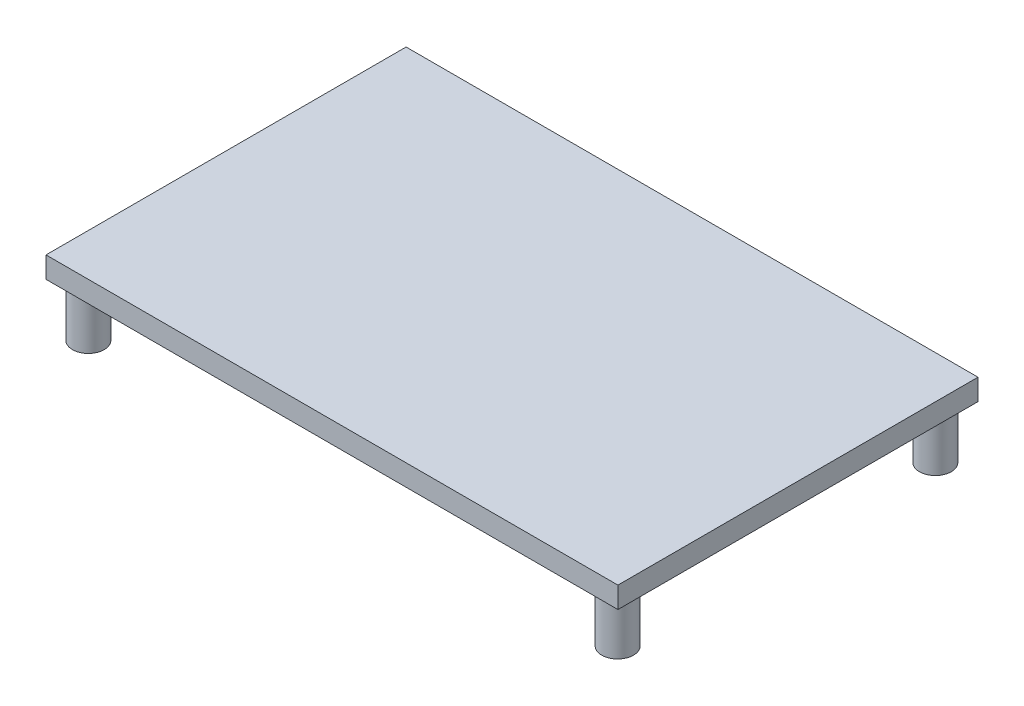
ISO-10303-21;
HEADER;
FILE_DESCRIPTION(('STEP AP214'),'2;1');
FILE_NAME('part.step','',(''),(''),'','','');
FILE_SCHEMA(('AUTOMOTIVE_DESIGN { 1 0 10303 214 1 1 1 1 }'));
ENDSEC;
DATA;
#1=APPLICATION_CONTEXT('core data for automotive mechanical design processes');
#2=APPLICATION_PROTOCOL_DEFINITION('international standard','automotive_design',2000,#1);
#3=PRODUCT_CONTEXT('',#1,'mechanical');
#4=PRODUCT('Part','Part','',(#3));
#5=PRODUCT_RELATED_PRODUCT_CATEGORY('part','',(#4));
#6=PRODUCT_DEFINITION_FORMATION('','',#4);
#7=PRODUCT_DEFINITION_CONTEXT('part definition',#1,'design');
#8=PRODUCT_DEFINITION('design','',#6,#7);
#9=PRODUCT_DEFINITION_SHAPE('','',#8);
#10=(LENGTH_UNIT() NAMED_UNIT(*) SI_UNIT(.MILLI.,.METRE.));
#11=(NAMED_UNIT(*) PLANE_ANGLE_UNIT() SI_UNIT($,.RADIAN.));
#12=(NAMED_UNIT(*) SI_UNIT($,.STERADIAN.) SOLID_ANGLE_UNIT());
#13=UNCERTAINTY_MEASURE_WITH_UNIT(LENGTH_MEASURE(1.E-05),#10,'distance_accuracy_value','');
#14=(GEOMETRIC_REPRESENTATION_CONTEXT(3) GLOBAL_UNCERTAINTY_ASSIGNED_CONTEXT((#13)) GLOBAL_UNIT_ASSIGNED_CONTEXT((#10,
#11,#12)) REPRESENTATION_CONTEXT('',''));
#15=CARTESIAN_POINT('',(0.,0.,0.));
#16=DIRECTION('',(0.,0.,1.));
#17=DIRECTION('',(1.,0.,0.));
#18=AXIS2_PLACEMENT_3D('',#15,#16,#17);
#19=CARTESIAN_POINT('',(-42.0738607660712,2.,-39.0055651757915));
#20=DIRECTION('',(1.,0.,0.));
#21=DIRECTION('',(0.,0.,-1.));
#22=AXIS2_PLACEMENT_3D('',#19,#20,#21);
#23=PLANE('',#22);
#24=DIRECTION('',(0.,0.,1.));
#25=VECTOR('',#24,1.);
#26=CARTESIAN_POINT('',(-42.0738607660712,0.,-39.0055651757915));
#27=LINE('',#26,#25);
#28=CARTESIAN_POINT('',(-42.0738607660712,0.,-39.0055651757915));
#29=VERTEX_POINT('',#28);
#30=CARTESIAN_POINT('',(-42.0738607660712,0.,-5.00556517579136));
#31=VERTEX_POINT('',#30);
#32=EDGE_CURVE('E161',#29,#31,#27,.T.);
#33=ORIENTED_EDGE('',*,*,#32,.T.);
#34=DIRECTION('',(0.,-1.,0.));
#35=VECTOR('',#34,1.);
#36=CARTESIAN_POINT('',(-42.0738607660712,2.,-5.00556517579136));
#37=LINE('',#36,#35);
#38=CARTESIAN_POINT('',(-42.0738607660712,2.,-5.00556517579136));
#39=VERTEX_POINT('',#38);
#40=EDGE_CURVE('E184',#39,#31,#37,.T.);
#41=ORIENTED_EDGE('',*,*,#40,.F.);
#42=DIRECTION('',(0.,0.,1.));
#43=VECTOR('',#42,1.);
#44=CARTESIAN_POINT('',(-42.0738607660712,2.,-39.0055651757915));
#45=LINE('',#44,#43);
#46=CARTESIAN_POINT('',(-42.0738607660712,2.,-39.0055651757915));
#47=VERTEX_POINT('',#46);
#48=EDGE_CURVE('E162',#47,#39,#45,.T.);
#49=ORIENTED_EDGE('',*,*,#48,.F.);
#50=DIRECTION('',(0.,-1.,0.));
#51=VECTOR('',#50,1.);
#52=CARTESIAN_POINT('',(-42.0738607660712,2.,-39.0055651757915));
#53=LINE('',#52,#51);
#54=EDGE_CURVE('E64',#47,#29,#53,.T.);
#55=ORIENTED_EDGE('',*,*,#54,.T.);
#56=EDGE_LOOP('',(#33,#41,#49,#55));
#57=FACE_BOUND('',#56,.T.);
#58=ADVANCED_FACE('F48',(#57),#23,.F.);
#59=CARTESIAN_POINT('',(-42.0738607660712,2.,-5.00556517579136));
#60=DIRECTION('',(0.,0.,-1.));
#61=DIRECTION('',(-1.,0.,0.));
#62=AXIS2_PLACEMENT_3D('',#59,#60,#61);
#63=PLANE('',#62);
#64=DIRECTION('',(1.,0.,0.));
#65=VECTOR('',#64,1.);
#66=CARTESIAN_POINT('',(-42.0738607660712,0.,-5.00556517579136));
#67=LINE('',#66,#65);
#68=CARTESIAN_POINT('',(11.9261392339288,0.,-5.00556517579136));
#69=VERTEX_POINT('',#68);
#70=EDGE_CURVE('E172',#31,#69,#67,.T.);
#71=ORIENTED_EDGE('',*,*,#70,.T.);
#72=DIRECTION('',(0.,-1.,0.));
#73=VECTOR('',#72,1.);
#74=CARTESIAN_POINT('',(11.9261392339288,2.,-5.00556517579136));
#75=LINE('',#74,#73);
#76=CARTESIAN_POINT('',(11.9261392339288,2.,-5.00556517579136));
#77=VERTEX_POINT('',#76);
#78=EDGE_CURVE('E182',#77,#69,#75,.T.);
#79=ORIENTED_EDGE('',*,*,#78,.F.);
#80=DIRECTION('',(1.,0.,0.));
#81=VECTOR('',#80,1.);
#82=CARTESIAN_POINT('',(-42.0738607660712,2.,-5.00556517579136));
#83=LINE('',#82,#81);
#84=EDGE_CURVE('E91',#39,#77,#83,.T.);
#85=ORIENTED_EDGE('',*,*,#84,.F.);
#86=ORIENTED_EDGE('',*,*,#40,.T.);
#87=EDGE_LOOP('',(#71,#79,#85,#86));
#88=FACE_BOUND('',#87,.T.);
#89=ADVANCED_FACE('F218',(#88),#63,.F.);
#90=CARTESIAN_POINT('',(11.9261392339288,2.,-39.0055651757915));
#91=DIRECTION('',(1.,0.,0.));
#92=DIRECTION('',(0.,0.,-1.));
#93=AXIS2_PLACEMENT_3D('',#90,#91,#92);
#94=PLANE('',#93);
#95=DIRECTION('',(0.,0.,1.));
#96=VECTOR('',#95,1.);
#97=CARTESIAN_POINT('',(11.9261392339288,0.,-39.0055651757915));
#98=LINE('',#97,#96);
#99=CARTESIAN_POINT('',(11.9261392339288,0.,-39.0055651757915));
#100=VERTEX_POINT('',#99);
#101=EDGE_CURVE('E175',#100,#69,#98,.T.);
#102=ORIENTED_EDGE('',*,*,#101,.F.);
#103=DIRECTION('',(0.,-1.,0.));
#104=VECTOR('',#103,1.);
#105=CARTESIAN_POINT('',(11.9261392339288,2.,-39.0055651757915));
#106=LINE('',#105,#104);
#107=CARTESIAN_POINT('',(11.9261392339288,2.,-39.0055651757915));
#108=VERTEX_POINT('',#107);
#109=EDGE_CURVE('E79',#108,#100,#106,.T.);
#110=ORIENTED_EDGE('',*,*,#109,.F.);
#111=DIRECTION('',(0.,0.,1.));
#112=VECTOR('',#111,1.);
#113=CARTESIAN_POINT('',(11.9261392339288,2.,-39.0055651757915));
#114=LINE('',#113,#112);
#115=EDGE_CURVE('E166',#108,#77,#114,.T.);
#116=ORIENTED_EDGE('',*,*,#115,.T.);
#117=ORIENTED_EDGE('',*,*,#78,.T.);
#118=EDGE_LOOP('',(#102,#110,#116,#117));
#119=FACE_BOUND('',#118,.T.);
#120=ADVANCED_FACE('F210',(#119),#94,.T.);
#121=CARTESIAN_POINT('',(-42.0738607660712,2.,-39.0055651757915));
#122=DIRECTION('',(0.,0.,-1.));
#123=DIRECTION('',(-1.,0.,0.));
#124=AXIS2_PLACEMENT_3D('',#121,#122,#123);
#125=PLANE('',#124);
#126=DIRECTION('',(1.,0.,0.));
#127=VECTOR('',#126,1.);
#128=CARTESIAN_POINT('',(-42.0738607660712,0.,-39.0055651757915));
#129=LINE('',#128,#127);
#130=EDGE_CURVE('E164',#29,#100,#129,.T.);
#131=ORIENTED_EDGE('',*,*,#130,.F.);
#132=ORIENTED_EDGE('',*,*,#54,.F.);
#133=DIRECTION('',(1.,0.,0.));
#134=VECTOR('',#133,1.);
#135=CARTESIAN_POINT('',(-42.0738607660712,2.,-39.0055651757915));
#136=LINE('',#135,#134);
#137=EDGE_CURVE('E169',#47,#108,#136,.T.);
#138=ORIENTED_EDGE('',*,*,#137,.T.);
#139=ORIENTED_EDGE('',*,*,#109,.T.);
#140=EDGE_LOOP('',(#131,#132,#138,#139));
#141=FACE_BOUND('',#140,.T.);
#142=ADVANCED_FACE('F208',(#141),#125,.T.);
#143=CARTESIAN_POINT('',(0.,2.,0.));
#144=DIRECTION('',(0.,1.,0.));
#145=DIRECTION('',(0.,0.,1.));
#146=AXIS2_PLACEMENT_3D('',#143,#144,#145);
#147=PLANE('',#146);
#148=ORIENTED_EDGE('',*,*,#48,.T.);
#149=ORIENTED_EDGE('',*,*,#84,.T.);
#150=ORIENTED_EDGE('',*,*,#115,.F.);
#151=ORIENTED_EDGE('',*,*,#137,.F.);
#152=EDGE_LOOP('',(#148,#149,#150,#151));
#153=FACE_BOUND('',#152,.T.);
#154=ADVANCED_FACE('F200',(#153),#147,.T.);
#155=CARTESIAN_POINT('',(0.,0.,0.));
#156=DIRECTION('',(0.,1.,0.));
#157=DIRECTION('',(0.,0.,1.));
#158=AXIS2_PLACEMENT_3D('',#155,#156,#157);
#159=PLANE('',#158);
#160=CARTESIAN_POINT('',(-40.0738607660712,0.,-37.0055651757914));
#161=DIRECTION('',(0.,1.,0.));
#162=DIRECTION('',(0.,0.,1.));
#163=AXIS2_PLACEMENT_3D('',#160,#161,#162);
#164=CIRCLE('',#163,1.5);
#165=CARTESIAN_POINT('',(-40.0738607660712,0.,-35.5055651757914));
#166=VERTEX_POINT('',#165);
#167=EDGE_CURVE('E11',#166,#166,#164,.F.);
#168=ORIENTED_EDGE('',*,*,#167,.F.);
#169=EDGE_LOOP('',(#168));
#170=FACE_BOUND('',#169,.T.);
#171=CARTESIAN_POINT('',(-40.0738607660712,0.,-7.00556517579136));
#172=DIRECTION('',(0.,1.,0.));
#173=DIRECTION('',(0.,0.,1.));
#174=AXIS2_PLACEMENT_3D('',#171,#172,#173);
#175=CIRCLE('',#174,1.5);
#176=CARTESIAN_POINT('',(-40.0738607660712,0.,-5.50556517579136));
#177=VERTEX_POINT('',#176);
#178=EDGE_CURVE('E56',#177,#177,#175,.F.);
#179=ORIENTED_EDGE('',*,*,#178,.F.);
#180=EDGE_LOOP('',(#179));
#181=FACE_BOUND('',#180,.T.);
#182=CARTESIAN_POINT('',(9.89786334253558,0.,-7.00670077458383));
#183=DIRECTION('',(0.,1.,0.));
#184=DIRECTION('',(0.,0.,1.));
#185=AXIS2_PLACEMENT_3D('',#182,#183,#184);
#186=CIRCLE('',#185,1.5);
#187=CARTESIAN_POINT('',(9.89786334253558,0.,-5.50670077458383));
#188=VERTEX_POINT('',#187);
#189=EDGE_CURVE('E189',#188,#188,#186,.F.);
#190=ORIENTED_EDGE('',*,*,#189,.F.);
#191=EDGE_LOOP('',(#190));
#192=FACE_BOUND('',#191,.T.);
#193=CARTESIAN_POINT('',(9.89786334253558,0.,-37.0067007745839));
#194=DIRECTION('',(0.,1.,0.));
#195=DIRECTION('',(0.,0.,1.));
#196=AXIS2_PLACEMENT_3D('',#193,#194,#195);
#197=CIRCLE('',#196,1.5);
#198=CARTESIAN_POINT('',(9.89786334253558,0.,-35.5067007745839));
#199=VERTEX_POINT('',#198);
#200=EDGE_CURVE('E186',#199,#199,#197,.F.);
#201=ORIENTED_EDGE('',*,*,#200,.F.);
#202=EDGE_LOOP('',(#201));
#203=FACE_BOUND('',#202,.T.);
#204=ORIENTED_EDGE('',*,*,#32,.F.);
#205=ORIENTED_EDGE('',*,*,#130,.T.);
#206=ORIENTED_EDGE('',*,*,#101,.T.);
#207=ORIENTED_EDGE('',*,*,#70,.F.);
#208=EDGE_LOOP('',(#204,#205,#206,#207));
#209=FACE_BOUND('',#208,.T.);
#210=ADVANCED_FACE('F196',(#170,#181,#192,#203,#209),#159,.F.);
#211=CARTESIAN_POINT('',(9.89786334253558,-5.,-37.0067007745839));
#212=DIRECTION('',(0.,1.,0.));
#213=DIRECTION('',(0.,0.,1.));
#214=AXIS2_PLACEMENT_3D('',#211,#212,#213);
#215=CYLINDRICAL_SURFACE('',#214,1.5);
#216=CARTESIAN_POINT('',(9.89786334253558,-5.,-37.0067007745839));
#217=DIRECTION('',(0.,-1.,0.));
#218=DIRECTION('',(0.,0.,-1.));
#219=AXIS2_PLACEMENT_3D('',#216,#217,#218);
#220=CIRCLE('',#219,1.5);
#221=CARTESIAN_POINT('',(9.89786334253558,-5.,-38.5067007745839));
#222=VERTEX_POINT('',#221);
#223=EDGE_CURVE('E153',#222,#222,#220,.T.);
#224=ORIENTED_EDGE('',*,*,#223,.F.);
#225=EDGE_LOOP('',(#224));
#226=FACE_BOUND('',#225,.T.);
#227=ORIENTED_EDGE('',*,*,#200,.T.);
#228=EDGE_LOOP('',(#227));
#229=FACE_BOUND('',#228,.T.);
#230=ADVANCED_FACE('F199',(#226,#229),#215,.T.);
#231=CARTESIAN_POINT('',(9.89786334253558,-5.,-37.0067007745839));
#232=DIRECTION('',(0.,-1.,0.));
#233=DIRECTION('',(0.,0.,-1.));
#234=AXIS2_PLACEMENT_3D('',#231,#232,#233);
#235=PLANE('',#234);
#236=CARTESIAN_POINT('',(9.89786334253558,-5.,-37.0067007745839));
#237=DIRECTION('',(0.,-1.,0.));
#238=DIRECTION('',(0.,0.,-1.));
#239=AXIS2_PLACEMENT_3D('',#236,#237,#238);
#240=CIRCLE('',#239,0.625000000000001);
#241=CARTESIAN_POINT('',(9.89786334253558,-5.,-37.6317007745839));
#242=VERTEX_POINT('',#241);
#243=EDGE_CURVE('E140',#242,#242,#240,.T.);
#244=ORIENTED_EDGE('',*,*,#243,.F.);
#245=EDGE_LOOP('',(#244));
#246=FACE_BOUND('',#245,.T.);
#247=ORIENTED_EDGE('',*,*,#223,.T.);
#248=EDGE_LOOP('',(#247));
#249=FACE_BOUND('',#248,.T.);
#250=ADVANCED_FACE('F260',(#246,#249),#235,.T.);
#251=CARTESIAN_POINT('',(9.89786334253558,-5.,-7.00670077458383));
#252=DIRECTION('',(0.,1.,0.));
#253=DIRECTION('',(0.,0.,1.));
#254=AXIS2_PLACEMENT_3D('',#251,#252,#253);
#255=CYLINDRICAL_SURFACE('',#254,1.5);
#256=CARTESIAN_POINT('',(9.89786334253558,-5.,-7.00670077458383));
#257=DIRECTION('',(0.,-1.,0.));
#258=DIRECTION('',(0.,0.,-1.));
#259=AXIS2_PLACEMENT_3D('',#256,#257,#258);
#260=CIRCLE('',#259,1.5);
#261=CARTESIAN_POINT('',(9.89786334253558,-5.,-8.50670077458383));
#262=VERTEX_POINT('',#261);
#263=EDGE_CURVE('E150',#262,#262,#260,.T.);
#264=ORIENTED_EDGE('',*,*,#263,.F.);
#265=EDGE_LOOP('',(#264));
#266=FACE_BOUND('',#265,.T.);
#267=ORIENTED_EDGE('',*,*,#189,.T.);
#268=EDGE_LOOP('',(#267));
#269=FACE_BOUND('',#268,.T.);
#270=ADVANCED_FACE('F272',(#266,#269),#255,.T.);
#271=CARTESIAN_POINT('',(9.89786334253558,-5.,-7.00670077458383));
#272=DIRECTION('',(0.,-1.,0.));
#273=DIRECTION('',(0.,0.,-1.));
#274=AXIS2_PLACEMENT_3D('',#271,#272,#273);
#275=PLANE('',#274);
#276=CARTESIAN_POINT('',(9.89786334253558,-5.,-7.00670077458383));
#277=DIRECTION('',(0.,-1.,0.));
#278=DIRECTION('',(0.,0.,-1.));
#279=AXIS2_PLACEMENT_3D('',#276,#277,#278);
#280=CIRCLE('',#279,0.625000000000001);
#281=CARTESIAN_POINT('',(9.89786334253558,-5.,-7.63170077458383));
#282=VERTEX_POINT('',#281);
#283=EDGE_CURVE('E131',#282,#282,#280,.T.);
#284=ORIENTED_EDGE('',*,*,#283,.F.);
#285=EDGE_LOOP('',(#284));
#286=FACE_BOUND('',#285,.T.);
#287=ORIENTED_EDGE('',*,*,#263,.T.);
#288=EDGE_LOOP('',(#287));
#289=FACE_BOUND('',#288,.T.);
#290=ADVANCED_FACE('F283',(#286,#289),#275,.T.);
#291=CARTESIAN_POINT('',(-40.0738607660712,-5.,-7.00556517579136));
#292=DIRECTION('',(0.,1.,0.));
#293=DIRECTION('',(0.,0.,1.));
#294=AXIS2_PLACEMENT_3D('',#291,#292,#293);
#295=CYLINDRICAL_SURFACE('',#294,1.5);
#296=CARTESIAN_POINT('',(-40.0738607660712,-5.,-7.00556517579136));
#297=DIRECTION('',(0.,-1.,0.));
#298=DIRECTION('',(0.,0.,-1.));
#299=AXIS2_PLACEMENT_3D('',#296,#297,#298);
#300=CIRCLE('',#299,1.5);
#301=CARTESIAN_POINT('',(-40.0738607660712,-5.,-8.50556517579136));
#302=VERTEX_POINT('',#301);
#303=EDGE_CURVE('E154',#302,#302,#300,.T.);
#304=ORIENTED_EDGE('',*,*,#303,.F.);
#305=EDGE_LOOP('',(#304));
#306=FACE_BOUND('',#305,.T.);
#307=ORIENTED_EDGE('',*,*,#178,.T.);
#308=EDGE_LOOP('',(#307));
#309=FACE_BOUND('',#308,.T.);
#310=ADVANCED_FACE('F194',(#306,#309),#295,.T.);
#311=CARTESIAN_POINT('',(-40.0738607660712,-5.,-7.00556517579136));
#312=DIRECTION('',(0.,-1.,0.));
#313=DIRECTION('',(0.,0.,-1.));
#314=AXIS2_PLACEMENT_3D('',#311,#312,#313);
#315=PLANE('',#314);
#316=CARTESIAN_POINT('',(-40.0738607660712,-5.,-7.00556517579136));
#317=DIRECTION('',(0.,-1.,0.));
#318=DIRECTION('',(0.,0.,-1.));
#319=AXIS2_PLACEMENT_3D('',#316,#317,#318);
#320=CIRCLE('',#319,0.625000000000001);
#321=CARTESIAN_POINT('',(-40.0738607660712,-5.,-7.63056517579136));
#322=VERTEX_POINT('',#321);
#323=EDGE_CURVE('E122',#322,#322,#320,.T.);
#324=ORIENTED_EDGE('',*,*,#323,.F.);
#325=EDGE_LOOP('',(#324));
#326=FACE_BOUND('',#325,.T.);
#327=ORIENTED_EDGE('',*,*,#303,.T.);
#328=EDGE_LOOP('',(#327));
#329=FACE_BOUND('',#328,.T.);
#330=ADVANCED_FACE('F303',(#326,#329),#315,.T.);
#331=CARTESIAN_POINT('',(-40.0738607660712,-5.,-37.0055651757914));
#332=DIRECTION('',(0.,1.,0.));
#333=DIRECTION('',(0.,0.,1.));
#334=AXIS2_PLACEMENT_3D('',#331,#332,#333);
#335=CYLINDRICAL_SURFACE('',#334,1.5);
#336=CARTESIAN_POINT('',(-40.0738607660712,-5.,-37.0055651757914));
#337=DIRECTION('',(0.,-1.,0.));
#338=DIRECTION('',(0.,0.,-1.));
#339=AXIS2_PLACEMENT_3D('',#336,#337,#338);
#340=CIRCLE('',#339,1.5);
#341=CARTESIAN_POINT('',(-40.0738607660712,-5.,-38.5055651757914));
#342=VERTEX_POINT('',#341);
#343=EDGE_CURVE('E149',#342,#342,#340,.T.);
#344=ORIENTED_EDGE('',*,*,#343,.F.);
#345=EDGE_LOOP('',(#344));
#346=FACE_BOUND('',#345,.T.);
#347=ORIENTED_EDGE('',*,*,#167,.T.);
#348=EDGE_LOOP('',(#347));
#349=FACE_BOUND('',#348,.T.);
#350=ADVANCED_FACE('F313',(#346,#349),#335,.T.);
#351=CARTESIAN_POINT('',(-40.0738607660712,-5.,-37.0055651757914));
#352=DIRECTION('',(0.,-1.,0.));
#353=DIRECTION('',(0.,0.,-1.));
#354=AXIS2_PLACEMENT_3D('',#351,#352,#353);
#355=PLANE('',#354);
#356=CARTESIAN_POINT('',(-40.0738607660712,-5.,-37.0055651757914));
#357=DIRECTION('',(0.,-1.,0.));
#358=DIRECTION('',(0.,0.,-1.));
#359=AXIS2_PLACEMENT_3D('',#356,#357,#358);
#360=CIRCLE('',#359,0.625000000000001);
#361=CARTESIAN_POINT('',(-40.0738607660712,-5.,-37.6305651757914));
#362=VERTEX_POINT('',#361);
#363=EDGE_CURVE('E115',#362,#362,#360,.T.);
#364=ORIENTED_EDGE('',*,*,#363,.F.);
#365=EDGE_LOOP('',(#364));
#366=FACE_BOUND('',#365,.T.);
#367=ORIENTED_EDGE('',*,*,#343,.T.);
#368=EDGE_LOOP('',(#367));
#369=FACE_BOUND('',#368,.T.);
#370=ADVANCED_FACE('F323',(#366,#369),#355,.T.);
#371=CARTESIAN_POINT('',(9.89786334253558,0.,-37.0067007745839));
#372=DIRECTION('',(0.,-1.,0.));
#373=DIRECTION('',(0.,0.,-1.));
#374=AXIS2_PLACEMENT_3D('',#371,#372,#373);
#375=CONICAL_SURFACE('',#374,0.475,1.02974425867665);
#376=CARTESIAN_POINT('',(9.89786334253557,0.285408794038091,-37.0067007745839));
#377=VERTEX_POINT('',#376);
#378=VERTEX_LOOP('',#377);
#379=FACE_BOUND('',#378,.T.);
#380=CARTESIAN_POINT('',(9.89786334253558,0.,-37.0067007745839));
#381=DIRECTION('',(0.,-1.,0.));
#382=DIRECTION('',(0.,0.,-1.));
#383=AXIS2_PLACEMENT_3D('',#380,#381,#382);
#384=CIRCLE('',#383,0.475);
#385=CARTESIAN_POINT('',(9.89786334253558,0.,-37.4817007745839));
#386=VERTEX_POINT('',#385);
#387=EDGE_CURVE('E146',#386,#386,#384,.T.);
#388=ORIENTED_EDGE('',*,*,#387,.T.);
#389=EDGE_LOOP('',(#388));
#390=FACE_BOUND('',#389,.T.);
#391=ADVANCED_FACE('F333',(#379,#390),#375,.F.);
#392=CARTESIAN_POINT('',(9.89786334253558,-5.,-37.0067007745839));
#393=DIRECTION('',(0.,-1.,0.));
#394=DIRECTION('',(0.,0.,-1.));
#395=AXIS2_PLACEMENT_3D('',#392,#393,#394);
#396=CYLINDRICAL_SURFACE('',#395,0.475);
#397=ORIENTED_EDGE('',*,*,#387,.F.);
#398=EDGE_LOOP('',(#397));
#399=FACE_BOUND('',#398,.T.);
#400=CARTESIAN_POINT('',(9.89786334253558,-4.85,-37.0067007745839));
#401=DIRECTION('',(0.,-1.,0.));
#402=DIRECTION('',(0.,0.,-1.));
#403=AXIS2_PLACEMENT_3D('',#400,#401,#402);
#404=CIRCLE('',#403,0.475);
#405=CARTESIAN_POINT('',(9.89786334253558,-4.85,-37.4817007745839));
#406=VERTEX_POINT('',#405);
#407=EDGE_CURVE('E143',#406,#406,#404,.T.);
#408=ORIENTED_EDGE('',*,*,#407,.T.);
#409=EDGE_LOOP('',(#408));
#410=FACE_BOUND('',#409,.T.);
#411=ADVANCED_FACE('F343',(#399,#410),#396,.F.);
#412=CARTESIAN_POINT('',(9.89786334253558,-5.,-37.0067007745839));
#413=DIRECTION('',(0.,-1.,0.));
#414=DIRECTION('',(0.,0.,-1.));
#415=AXIS2_PLACEMENT_3D('',#412,#413,#414);
#416=CONICAL_SURFACE('',#415,0.625000000000001,0.785398163397445);
#417=ORIENTED_EDGE('',*,*,#407,.F.);
#418=EDGE_LOOP('',(#417));
#419=FACE_BOUND('',#418,.T.);
#420=ORIENTED_EDGE('',*,*,#243,.T.);
#421=EDGE_LOOP('',(#420));
#422=FACE_BOUND('',#421,.T.);
#423=ADVANCED_FACE('F354',(#419,#422),#416,.F.);
#424=CARTESIAN_POINT('',(9.89786334253558,0.,-7.00670077458383));
#425=DIRECTION('',(0.,-1.,0.));
#426=DIRECTION('',(0.,0.,-1.));
#427=AXIS2_PLACEMENT_3D('',#424,#425,#426);
#428=CONICAL_SURFACE('',#427,0.475,1.02974425867665);
#429=CARTESIAN_POINT('',(9.89786334253557,0.285408794038091,-7.00670077458383));
#430=VERTEX_POINT('',#429);
#431=VERTEX_LOOP('',#430);
#432=FACE_BOUND('',#431,.T.);
#433=CARTESIAN_POINT('',(9.89786334253558,0.,-7.00670077458383));
#434=DIRECTION('',(0.,-1.,0.));
#435=DIRECTION('',(0.,0.,-1.));
#436=AXIS2_PLACEMENT_3D('',#433,#434,#435);
#437=CIRCLE('',#436,0.475);
#438=CARTESIAN_POINT('',(9.89786334253558,0.,-7.48170077458383));
#439=VERTEX_POINT('',#438);
#440=EDGE_CURVE('E137',#439,#439,#437,.T.);
#441=ORIENTED_EDGE('',*,*,#440,.T.);
#442=EDGE_LOOP('',(#441));
#443=FACE_BOUND('',#442,.T.);
#444=ADVANCED_FACE('F366',(#432,#443),#428,.F.);
#445=CARTESIAN_POINT('',(9.89786334253558,-5.,-7.00670077458383));
#446=DIRECTION('',(0.,-1.,0.));
#447=DIRECTION('',(0.,0.,-1.));
#448=AXIS2_PLACEMENT_3D('',#445,#446,#447);
#449=CYLINDRICAL_SURFACE('',#448,0.475);
#450=ORIENTED_EDGE('',*,*,#440,.F.);
#451=EDGE_LOOP('',(#450));
#452=FACE_BOUND('',#451,.T.);
#453=CARTESIAN_POINT('',(9.89786334253558,-4.85,-7.00670077458383));
#454=DIRECTION('',(0.,-1.,0.));
#455=DIRECTION('',(0.,0.,-1.));
#456=AXIS2_PLACEMENT_3D('',#453,#454,#455);
#457=CIRCLE('',#456,0.475);
#458=CARTESIAN_POINT('',(9.89786334253558,-4.85,-7.48170077458383));
#459=VERTEX_POINT('',#458);
#460=EDGE_CURVE('E134',#459,#459,#457,.T.);
#461=ORIENTED_EDGE('',*,*,#460,.T.);
#462=EDGE_LOOP('',(#461));
#463=FACE_BOUND('',#462,.T.);
#464=ADVANCED_FACE('F376',(#452,#463),#449,.F.);
#465=CARTESIAN_POINT('',(9.89786334253558,-5.,-7.00670077458383));
#466=DIRECTION('',(0.,-1.,0.));
#467=DIRECTION('',(0.,0.,-1.));
#468=AXIS2_PLACEMENT_3D('',#465,#466,#467);
#469=CONICAL_SURFACE('',#468,0.625000000000001,0.785398163397445);
#470=ORIENTED_EDGE('',*,*,#460,.F.);
#471=EDGE_LOOP('',(#470));
#472=FACE_BOUND('',#471,.T.);
#473=ORIENTED_EDGE('',*,*,#283,.T.);
#474=EDGE_LOOP('',(#473));
#475=FACE_BOUND('',#474,.T.);
#476=ADVANCED_FACE('F387',(#472,#475),#469,.F.);
#477=CARTESIAN_POINT('',(-40.0738607660712,0.,-37.0055651757914));
#478=DIRECTION('',(0.,-1.,0.));
#479=DIRECTION('',(0.,0.,-1.));
#480=AXIS2_PLACEMENT_3D('',#477,#478,#479);
#481=CONICAL_SURFACE('',#480,0.474999999999996,1.02974425867665);
#482=CARTESIAN_POINT('',(-40.0738607660712,0.285408794038091,-37.0055651757914));
#483=VERTEX_POINT('',#482);
#484=VERTEX_LOOP('',#483);
#485=FACE_BOUND('',#484,.T.);
#486=CARTESIAN_POINT('',(-40.0738607660712,0.,-37.0055651757914));
#487=DIRECTION('',(0.,-1.,0.));
#488=DIRECTION('',(0.,0.,-1.));
#489=AXIS2_PLACEMENT_3D('',#486,#487,#488);
#490=CIRCLE('',#489,0.474999999999996);
#491=CARTESIAN_POINT('',(-40.0738607660712,0.,-37.4805651757914));
#492=VERTEX_POINT('',#491);
#493=EDGE_CURVE('E128',#492,#492,#490,.T.);
#494=ORIENTED_EDGE('',*,*,#493,.T.);
#495=EDGE_LOOP('',(#494));
#496=FACE_BOUND('',#495,.T.);
#497=ADVANCED_FACE('F399',(#485,#496),#481,.F.);
#498=CARTESIAN_POINT('',(-40.0738607660712,-5.,-37.0055651757914));
#499=DIRECTION('',(0.,-1.,0.));
#500=DIRECTION('',(0.,0.,-1.));
#501=AXIS2_PLACEMENT_3D('',#498,#499,#500);
#502=CYLINDRICAL_SURFACE('',#501,0.474999999999996);
#503=ORIENTED_EDGE('',*,*,#493,.F.);
#504=EDGE_LOOP('',(#503));
#505=FACE_BOUND('',#504,.T.);
#506=CARTESIAN_POINT('',(-40.0738607660712,-4.85,-37.0055651757914));
#507=DIRECTION('',(0.,-1.,0.));
#508=DIRECTION('',(0.,0.,-1.));
#509=AXIS2_PLACEMENT_3D('',#506,#507,#508);
#510=CIRCLE('',#509,0.474999999999996);
#511=CARTESIAN_POINT('',(-40.0738607660712,-4.85,-37.4805651757914));
#512=VERTEX_POINT('',#511);
#513=EDGE_CURVE('E119',#512,#512,#510,.T.);
#514=ORIENTED_EDGE('',*,*,#513,.T.);
#515=EDGE_LOOP('',(#514));
#516=FACE_BOUND('',#515,.T.);
#517=ADVANCED_FACE('F409',(#505,#516),#502,.F.);
#518=CARTESIAN_POINT('',(-40.0738607660712,-5.,-37.0055651757914));
#519=DIRECTION('',(0.,-1.,0.));
#520=DIRECTION('',(0.,0.,-1.));
#521=AXIS2_PLACEMENT_3D('',#518,#519,#520);
#522=CONICAL_SURFACE('',#521,0.625000000000001,0.785398163397457);
#523=ORIENTED_EDGE('',*,*,#513,.F.);
#524=EDGE_LOOP('',(#523));
#525=FACE_BOUND('',#524,.T.);
#526=ORIENTED_EDGE('',*,*,#363,.T.);
#527=EDGE_LOOP('',(#526));
#528=FACE_BOUND('',#527,.T.);
#529=ADVANCED_FACE('F109',(#525,#528),#522,.F.);
#530=CARTESIAN_POINT('',(-40.0738607660712,0.,-7.00556517579136));
#531=DIRECTION('',(0.,-1.,0.));
#532=DIRECTION('',(0.,0.,-1.));
#533=AXIS2_PLACEMENT_3D('',#530,#531,#532);
#534=CONICAL_SURFACE('',#533,0.474999999999996,1.02974425867665);
#535=CARTESIAN_POINT('',(-40.0738607660712,0.285408794038091,-7.00556517579136));
#536=VERTEX_POINT('',#535);
#537=VERTEX_LOOP('',#536);
#538=FACE_BOUND('',#537,.T.);
#539=CARTESIAN_POINT('',(-40.0738607660712,0.,-7.00556517579136));
#540=DIRECTION('',(0.,-1.,0.));
#541=DIRECTION('',(0.,0.,-1.));
#542=AXIS2_PLACEMENT_3D('',#539,#540,#541);
#543=CIRCLE('',#542,0.474999999999996);
#544=CARTESIAN_POINT('',(-40.0738607660712,0.,-7.48056517579135));
#545=VERTEX_POINT('',#544);
#546=EDGE_CURVE('E113',#545,#545,#543,.T.);
#547=ORIENTED_EDGE('',*,*,#546,.T.);
#548=EDGE_LOOP('',(#547));
#549=FACE_BOUND('',#548,.T.);
#550=ADVANCED_FACE('F105',(#538,#549),#534,.F.);
#551=CARTESIAN_POINT('',(-40.0738607660712,-5.,-7.00556517579136));
#552=DIRECTION('',(0.,-1.,0.));
#553=DIRECTION('',(0.,0.,-1.));
#554=AXIS2_PLACEMENT_3D('',#551,#552,#553);
#555=CYLINDRICAL_SURFACE('',#554,0.474999999999996);
#556=ORIENTED_EDGE('',*,*,#546,.F.);
#557=EDGE_LOOP('',(#556));
#558=FACE_BOUND('',#557,.T.);
#559=CARTESIAN_POINT('',(-40.0738607660712,-4.85,-7.00556517579136));
#560=DIRECTION('',(0.,-1.,0.));
#561=DIRECTION('',(0.,0.,-1.));
#562=AXIS2_PLACEMENT_3D('',#559,#560,#561);
#563=CIRCLE('',#562,0.474999999999996);
#564=CARTESIAN_POINT('',(-40.0738607660712,-4.85,-7.48056517579135));
#565=VERTEX_POINT('',#564);
#566=EDGE_CURVE('E116',#565,#565,#563,.T.);
#567=ORIENTED_EDGE('',*,*,#566,.T.);
#568=EDGE_LOOP('',(#567));
#569=FACE_BOUND('',#568,.T.);
#570=ADVANCED_FACE('F108',(#558,#569),#555,.F.);
#571=CARTESIAN_POINT('',(-40.0738607660712,-5.,-7.00556517579136));
#572=DIRECTION('',(0.,-1.,0.));
#573=DIRECTION('',(0.,0.,-1.));
#574=AXIS2_PLACEMENT_3D('',#571,#572,#573);
#575=CONICAL_SURFACE('',#574,0.625000000000001,0.785398163397457);
#576=ORIENTED_EDGE('',*,*,#566,.F.);
#577=EDGE_LOOP('',(#576));
#578=FACE_BOUND('',#577,.T.);
#579=ORIENTED_EDGE('',*,*,#323,.T.);
#580=EDGE_LOOP('',(#579));
#581=FACE_BOUND('',#580,.T.);
#582=ADVANCED_FACE('F447',(#578,#581),#575,.F.);
#583=CLOSED_SHELL('',(#58,#89,#120,#142,#154,#210,#230,#250,#270,#290,#310,#330,#350,#370,#391,
#411,#423,#444,#464,#476,#497,#517,#529,#550,#570,#582));
#584=MANIFOLD_SOLID_BREP('B2',#583);
#585=ADVANCED_BREP_SHAPE_REPRESENTATION('',(#18,#584),#14);
#586=SHAPE_DEFINITION_REPRESENTATION(#9,#585);
ENDSEC;
END-ISO-10303-21;
